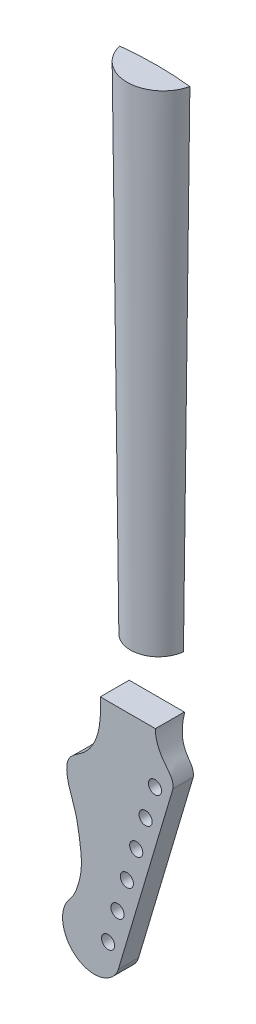
ISO-10303-21;
HEADER;
FILE_DESCRIPTION(('STEP AP214'),'2;1');
FILE_NAME('part.step','',(''),(''),'','','');
FILE_SCHEMA(('AUTOMOTIVE_DESIGN { 1 0 10303 214 1 1 1 1 }'));
ENDSEC;
DATA;
#1=APPLICATION_CONTEXT('core data for automotive mechanical design processes');
#2=APPLICATION_PROTOCOL_DEFINITION('international standard','automotive_design',2000,#1);
#3=PRODUCT_CONTEXT('',#1,'mechanical');
#4=PRODUCT('Part','Part','',(#3));
#5=PRODUCT_RELATED_PRODUCT_CATEGORY('part','',(#4));
#6=PRODUCT_DEFINITION_FORMATION('','',#4);
#7=PRODUCT_DEFINITION_CONTEXT('part definition',#1,'design');
#8=PRODUCT_DEFINITION('design','',#6,#7);
#9=PRODUCT_DEFINITION_SHAPE('','',#8);
#10=(LENGTH_UNIT() NAMED_UNIT(*) SI_UNIT(.MILLI.,.METRE.));
#11=(NAMED_UNIT(*) PLANE_ANGLE_UNIT() SI_UNIT($,.RADIAN.));
#12=(NAMED_UNIT(*) SI_UNIT($,.STERADIAN.) SOLID_ANGLE_UNIT());
#13=UNCERTAINTY_MEASURE_WITH_UNIT(LENGTH_MEASURE(1.E-05),#10,'distance_accuracy_value','');
#14=(GEOMETRIC_REPRESENTATION_CONTEXT(3) GLOBAL_UNCERTAINTY_ASSIGNED_CONTEXT((#13)) GLOBAL_UNIT_ASSIGNED_CONTEXT((#10,
#11,#12)) REPRESENTATION_CONTEXT('',''));
#15=CARTESIAN_POINT('',(0.,0.,0.));
#16=DIRECTION('',(0.,0.,1.));
#17=DIRECTION('',(1.,0.,0.));
#18=AXIS2_PLACEMENT_3D('',#15,#16,#17);
#19=CARTESIAN_POINT('',(56.6375080453473,-20.3369897013631,0.));
#20=DIRECTION('',(0.,0.,-1.));
#21=DIRECTION('',(-1.,0.,0.));
#22=AXIS2_PLACEMENT_3D('',#19,#20,#21);
#23=PLANE('',#22);
#24=CARTESIAN_POINT('',(64.4678967595988,-36.3869171248618,0.));
#25=CARTESIAN_POINT('',(65.2962653016021,-30.5662360862277,0.));
#26=CARTESIAN_POINT('',(56.4837621605687,-22.0007319523904,0.));
#27=CARTESIAN_POINT('',(50.9375501111084,-10.7673234647444,0.));
#28=CARTESIAN_POINT('',(51.151028,-3.25,0.));
#29=B_SPLINE_CURVE_WITH_KNOTS('',3,(#24,#25,#26,#27,#28),.UNSPECIFIED.,.F.,.F.,(4,1,4),(0.,
0.401837933237775,1.),.UNSPECIFIED.);
#30=CARTESIAN_POINT('',(51.1549542125218,-4.75,0.));
#31=VERTEX_POINT('',#30);
#32=CARTESIAN_POINT('',(51.151028,-3.25,0.));
#33=VERTEX_POINT('',#32);
#34=EDGE_CURVE('E239',#31,#33,#29,.T.);
#35=ORIENTED_EDGE('',*,*,#34,.F.);
#36=DIRECTION('',(-1.,0.,0.));
#37=VECTOR('',#36,1.);
#38=CARTESIAN_POINT('',(89.,-4.75,0.));
#39=LINE('',#38,#37);
#40=CARTESIAN_POINT('',(9.14908,-4.75,0.));
#41=VERTEX_POINT('',#40);
#42=EDGE_CURVE('E173',#31,#41,#39,.T.);
#43=ORIENTED_EDGE('',*,*,#42,.T.);
#44=DIRECTION('',(0.,-1.,0.));
#45=VECTOR('',#44,1.);
#46=CARTESIAN_POINT('',(9.14908,-3.25,0.));
#47=LINE('',#46,#45);
#48=CARTESIAN_POINT('',(9.14908,-3.25,0.));
#49=VERTEX_POINT('',#48);
#50=EDGE_CURVE('E155',#49,#41,#47,.T.);
#51=ORIENTED_EDGE('',*,*,#50,.F.);
#52=DIRECTION('',(-1.,0.,0.));
#53=VECTOR('',#52,1.);
#54=CARTESIAN_POINT('',(51.151028,-3.25,0.));
#55=LINE('',#54,#53);
#56=EDGE_CURVE('E319',#33,#49,#55,.T.);
#57=ORIENTED_EDGE('',*,*,#56,.F.);
#58=EDGE_LOOP('',(#35,#43,#51,#57));
#59=FACE_BOUND('',#58,.T.);
#60=ADVANCED_FACE('F49',(#59),#23,.T.);
#61=CARTESIAN_POINT('',(64.4678967595988,-36.3869171248618,22.));
#62=CARTESIAN_POINT('',(65.2962653016021,-30.5662360862277,22.));
#63=CARTESIAN_POINT('',(56.4837621605687,-22.0007319523904,22.));
#64=CARTESIAN_POINT('',(50.9375501111084,-10.7673234647444,22.));
#65=CARTESIAN_POINT('',(51.151028,-3.25,22.));
#66=B_SPLINE_CURVE_WITH_KNOTS('',3,(#61,#62,#63,#64,#65),.UNSPECIFIED.,.F.,.F.,(4,1,4),(0.,
0.401837933237775,1.),.UNSPECIFIED.);
#67=DIRECTION('',(0.,0.,-1.));
#68=VECTOR('',#67,1.);
#69=SURFACE_OF_LINEAR_EXTRUSION('',#66,#68);
#70=CARTESIAN_POINT('',(51.1549542125218,-4.75000002359859,4.21852207528305E-09));
#71=CARTESIAN_POINT('',(51.1680654468338,-5.14091643297609,0.150058757586606));
#72=CARTESIAN_POINT('',(51.1906814220311,-5.53154264494164,0.300006112774302));
#73=CARTESIAN_POINT('',(51.2545517430317,-6.31103438426002,0.599224958035812));
#74=CARTESIAN_POINT('',(51.2957855595916,-6.69990137569232,0.748497010118848));
#75=CARTESIAN_POINT('',(51.3965222496747,-7.4753379481485,1.04615922148701));
#76=CARTESIAN_POINT('',(51.4560147588833,-7.86190870602771,1.19454983252432));
#77=CARTESIAN_POINT('',(51.5927661422065,-8.63223932063184,1.4902520506242));
#78=CARTESIAN_POINT('',(51.6700224611351,-9.01599957344202,1.63756380972966));
#79=CARTESIAN_POINT('',(51.840038295133,-9.77272447515635,1.92804328389599));
#80=CARTESIAN_POINT('',(51.9324673798035,-10.1457539953343,2.07123590070518));
#81=CARTESIAN_POINT('',(52.1332053641683,-10.8881343898938,2.3562090344966));
#82=CARTESIAN_POINT('',(52.2415170784595,-11.2574845998414,2.49798929642658));
#83=CARTESIAN_POINT('',(52.4733131476984,-11.9920514774737,2.77996310207662));
#84=CARTESIAN_POINT('',(52.5967992872388,-12.3572676534475,2.92015645704661));
#85=CARTESIAN_POINT('',(52.8581714686001,-13.0831318388325,3.1987896121365));
#86=CARTESIAN_POINT('',(52.9960560072269,-13.443780320712,3.33722959362004));
#87=CARTESIAN_POINT('',(53.2798751215128,-14.1464328261318,3.60695261957817));
#88=CARTESIAN_POINT('',(53.4252932601499,-14.4886190444293,3.73830560206738));
#89=CARTESIAN_POINT('',(53.7280288740928,-15.1683273649276,3.99922118062102));
#90=CARTESIAN_POINT('',(53.8853451725619,-15.5058499245114,4.12878395225833));
#91=CARTESIAN_POINT('',(54.2112200264707,-16.176167239746,4.38609466163837));
#92=CARTESIAN_POINT('',(54.3797797481468,-16.5089615005924,4.51384240944352));
#93=CARTESIAN_POINT('',(54.7274837219142,-17.1697600424618,4.76749920407103));
#94=CARTESIAN_POINT('',(54.9066297805539,-17.4977634939578,4.89340793246781));
#95=CARTESIAN_POINT('',(55.2784161795221,-18.1552291549036,5.1457853539757));
#96=CARTESIAN_POINT('',(55.4712514860682,-18.4845951773182,5.27221712434334));
#97=CARTESIAN_POINT('',(55.8665364925132,-19.1382184097607,5.52311957574163));
#98=CARTESIAN_POINT('',(56.0689853946862,-19.4624760407143,5.64759041835047));
#99=CARTESIAN_POINT('',(56.4827947449292,-20.1058151737395,5.89454517384971));
#100=CARTESIAN_POINT('',(56.6941516381016,-20.4248986715523,6.01702985283335));
#101=CARTESIAN_POINT('',(57.1250817005319,-21.057828828609,6.25998897681674));
#102=CARTESIAN_POINT('',(57.3446480064048,-21.371679558657,6.38046498445179));
#103=CARTESIAN_POINT('',(57.5681076748866,-21.6830789205097,6.5));
#104=B_SPLINE_CURVE_WITH_KNOTS('',3,(#70,#71,#72,#73,#74,#75,#76,#77,#78,#79,#80,#81,#82,#83,
#84,#85,#86,#87,#88,#89,#90,#91,#92,#93,#94,#95,#96,#97,#98,#99,#100,#101,#102,#103),
.UNSPECIFIED.,.F.,.F.,(4,2,2,2,2,2,2,2,2,2,2,2,2,2,2,2,4),(0.,1.25667336214889,2.51196440576778,
3.76654421316922,5.02094367178069,6.25096763315607,7.48120983387477,8.71159685628633,
9.94185555435961,11.1246089514657,12.3072455160601,13.4900049422633,14.6729667913902,
15.8789869484353,17.0849072054945,18.2903506920355,19.4948079783741),.UNSPECIFIED.);
#105=CARTESIAN_POINT('',(53.9451946415747,-15.627067259028,4.17531492740211));
#106=VERTEX_POINT('',#105);
#107=EDGE_CURVE('E291',#31,#106,#104,.T.);
#108=ORIENTED_EDGE('',*,*,#107,.F.);
#109=ORIENTED_EDGE('',*,*,#34,.T.);
#110=DIRECTION('',(0.,0.,-1.));
#111=VECTOR('',#110,1.);
#112=CARTESIAN_POINT('',(51.151028,-3.25,22.));
#113=LINE('',#112,#111);
#114=CARTESIAN_POINT('',(51.151028,-3.25,22.));
#115=VERTEX_POINT('',#114);
#116=EDGE_CURVE('E162',#115,#33,#113,.T.);
#117=ORIENTED_EDGE('',*,*,#116,.F.);
#118=CARTESIAN_POINT('',(64.4678967595988,-36.3869171248618,22.));
#119=VERTEX_POINT('',#118);
#120=EDGE_CURVE('E215',#119,#115,#66,.T.);
#121=ORIENTED_EDGE('',*,*,#120,.F.);
#122=DIRECTION('',(0.,0.,-1.));
#123=VECTOR('',#122,1.);
#124=CARTESIAN_POINT('',(64.4678967595988,-36.3869171248618,22.));
#125=LINE('',#124,#123);
#126=CARTESIAN_POINT('',(64.4678967595988,-36.3869171248618,6.5));
#127=VERTEX_POINT('',#126);
#128=EDGE_CURVE('E165',#119,#127,#125,.T.);
#129=ORIENTED_EDGE('',*,*,#128,.T.);
#130=CARTESIAN_POINT('',(64.4678967595988,-36.3869171248618,6.5));
#131=CARTESIAN_POINT('',(65.2962653016021,-30.5662360862277,6.5));
#132=CARTESIAN_POINT('',(56.4837621605687,-22.0007319523904,6.5));
#133=CARTESIAN_POINT('',(50.9375501111084,-10.7673234647444,6.5));
#134=CARTESIAN_POINT('',(51.151028,-3.25,6.5));
#135=B_SPLINE_CURVE_WITH_KNOTS('',3,(#130,#131,#132,#133,#134),.UNSPECIFIED.,.F.,.F.,(4,1,4),
(0.,0.401837933237775,1.),.UNSPECIFIED.);
#136=CARTESIAN_POINT('',(62.4927121618197,-28.1699454925965,6.5));
#137=VERTEX_POINT('',#136);
#138=EDGE_CURVE('E136',#127,#137,#135,.T.);
#139=ORIENTED_EDGE('',*,*,#138,.T.);
#140=CARTESIAN_POINT('',(62.4927121610172,-28.1699454931134,6.5));
#141=CARTESIAN_POINT('',(62.375614539713,-27.9876341963071,6.49999392580149));
#142=CARTESIAN_POINT('',(62.255558318861,-27.8072669409178,6.49857546535381));
#143=CARTESIAN_POINT('',(62.0105828859032,-27.4499856605042,6.49305184864964));
#144=CARTESIAN_POINT('',(61.8856652381194,-27.2730705517058,6.48894755003454));
#145=CARTESIAN_POINT('',(61.6326274882078,-26.9230867739052,6.47821908608642));
#146=CARTESIAN_POINT('',(61.5045282261052,-26.7500025338295,6.47160859370002));
#147=CARTESIAN_POINT('',(61.2453877230433,-26.4061464062348,6.45595240036816));
#148=CARTESIAN_POINT('',(61.1143462289659,-26.2353747197049,6.44690648916389));
#149=CARTESIAN_POINT('',(60.7190525693369,-25.7268924262354,6.41628289898456));
#150=CARTESIAN_POINT('',(60.4517252212223,-25.3917867321417,6.39118044494661));
#151=CARTESIAN_POINT('',(60.0497152374659,-24.8914431801342,6.34650939088679));
#152=CARTESIAN_POINT('',(59.9157422718939,-24.7252934491955,6.33047853352343));
#153=CARTESIAN_POINT('',(59.6480543836191,-24.3930280143909,6.29601738312702));
#154=CARTESIAN_POINT('',(59.5143394631078,-24.2269123108245,6.27758706980656));
#155=CARTESIAN_POINT('',(59.2482854757439,-23.8946406176895,6.23830262335778));
#156=CARTESIAN_POINT('',(59.1159435900558,-23.7284860663392,6.21745548125596));
#157=CARTESIAN_POINT('',(58.918724686557,-23.4784915554692,6.18425177806883));
#158=CARTESIAN_POINT('',(58.8532008986447,-23.3950331865278,6.17286174864829));
#159=CARTESIAN_POINT('',(58.7226849015026,-23.2277945228981,6.14941952711127));
#160=CARTESIAN_POINT('',(58.6576926923494,-23.1440142281634,6.13736733489942));
#161=CARTESIAN_POINT('',(58.4638244243858,-22.8925236884775,6.10025289660904));
#162=CARTESIAN_POINT('',(58.335781907922,-22.7243161156035,6.07418668345491));
#163=CARTESIAN_POINT('',(58.0820206129897,-22.3866035608632,6.01930218003816));
#164=CARTESIAN_POINT('',(57.9563018640345,-22.2170985625572,5.99048385485059));
#165=CARTESIAN_POINT('',(57.5818311077652,-21.7053461997294,5.89955430165509));
#166=CARTESIAN_POINT('',(57.3367558274747,-21.3611453902544,5.83315671393475));
#167=CARTESIAN_POINT('',(56.8573766901676,-20.6679315543294,5.68837713837883));
#168=CARTESIAN_POINT('',(56.6230700943603,-20.318919781131,5.60999821992936));
#169=CARTESIAN_POINT('',(56.1658046654258,-19.6159195207824,5.44052917996557));
#170=CARTESIAN_POINT('',(55.9428601443982,-19.2619254403392,5.34942354238842));
#171=CARTESIAN_POINT('',(55.5089305766262,-18.5488187663214,5.15369283654371));
#172=CARTESIAN_POINT('',(55.2979832577829,-18.1896940385724,5.04902818317029));
#173=CARTESIAN_POINT('',(54.8886907547745,-17.4661761882196,4.82526649273988));
#174=CARTESIAN_POINT('',(54.6904145912704,-17.1017656187782,4.7060992411768));
#175=CARTESIAN_POINT('',(54.3071146221356,-16.3675770329247,4.45233203398029));
#176=CARTESIAN_POINT('',(54.1222004790933,-15.9977792544597,4.31762377971412));
#177=CARTESIAN_POINT('',(53.9451946415747,-15.6270672590279,4.17531492740206));
#178=B_SPLINE_CURVE_WITH_KNOTS('',3,(#140,#141,#142,#143,#144,#145,#146,#147,#148,#149,#150,
#151,#152,#153,#154,#155,#156,#157,#158,#159,#160,#161,#162,#163,#164,#165,#166,#167,#168,#169,
#170,#171,#172,#173,#174,#175,#176,#177),.UNSPECIFIED.,.F.,.F.,(4,2,2,2,2,2,2,2,2,2,2,2,2,2,2,2,
2,2,4),(0.,0.649946905278127,1.29968637082793,1.94593093055724,2.59223130089823,
3.88025543201119,4.52235862228419,5.16446724189611,5.80476275554744,6.12490861336931,
6.44505451730247,7.08400981305202,7.72297321837733,9.00579587777505,10.288290451773,
11.5723624800126,12.8602715580577,14.1546845941654,15.4587352324983),.UNSPECIFIED.);
#179=EDGE_CURVE('E188',#137,#106,#178,.T.);
#180=ORIENTED_EDGE('',*,*,#179,.T.);
#181=EDGE_LOOP('',(#108,#109,#117,#121,#129,#139,#180));
#182=FACE_BOUND('',#181,.T.);
#183=ADVANCED_FACE('F204',(#182),#69,.F.);
#184=CARTESIAN_POINT('',(9.14908,-3.25,22.));
#185=DIRECTION('',(1.,0.,0.));
#186=DIRECTION('',(0.,0.,-1.));
#187=AXIS2_PLACEMENT_3D('',#184,#185,#186);
#188=PLANE('',#187);
#189=DIRECTION('',(0.,0.933580426497202,-0.358367949545301));
#190=VECTOR('',#189,1.);
#191=CARTESIAN_POINT('',(9.14908,-10.8030780508394,2.32355896497953));
#192=LINE('',#191,#190);
#193=CARTESIAN_POINT('',(9.14908,-15.6270672590279,4.17531492740205));
#194=VERTEX_POINT('',#193);
#195=EDGE_CURVE('E300',#194,#41,#192,.T.);
#196=ORIENTED_EDGE('',*,*,#195,.F.);
#197=CARTESIAN_POINT('',(9.14908,-28.1699454931134,-28.5));
#198=DIRECTION('',(1.,0.,0.));
#199=DIRECTION('',(0.,0.,-1.));
#200=AXIS2_PLACEMENT_3D('',#197,#198,#199);
#201=CIRCLE('',#200,35.);
#202=CARTESIAN_POINT('',(9.14908,-15.8461860828899,4.25858595847703));
#203=VERTEX_POINT('',#202);
#204=EDGE_CURVE('E178',#194,#203,#201,.T.);
#205=ORIENTED_EDGE('',*,*,#204,.T.);
#206=DIRECTION('',(0.,0.,-1.));
#207=VECTOR('',#206,1.);
#208=CARTESIAN_POINT('',(9.14908,-15.8461860828899,22.));
#209=LINE('',#208,#207);
#210=CARTESIAN_POINT('',(9.14908,-15.8461860828899,22.));
#211=VERTEX_POINT('',#210);
#212=EDGE_CURVE('E150',#211,#203,#209,.T.);
#213=ORIENTED_EDGE('',*,*,#212,.F.);
#214=DIRECTION('',(0.,-1.,0.));
#215=VECTOR('',#214,1.);
#216=CARTESIAN_POINT('',(9.14908,-3.25,22.));
#217=LINE('',#216,#215);
#218=CARTESIAN_POINT('',(9.14908,-3.25,22.));
#219=VERTEX_POINT('',#218);
#220=EDGE_CURVE('E228',#219,#211,#217,.T.);
#221=ORIENTED_EDGE('',*,*,#220,.F.);
#222=DIRECTION('',(0.,0.,-1.));
#223=VECTOR('',#222,1.);
#224=CARTESIAN_POINT('',(9.14908,-3.25,22.));
#225=LINE('',#224,#223);
#226=EDGE_CURVE('E159',#219,#49,#225,.T.);
#227=ORIENTED_EDGE('',*,*,#226,.T.);
#228=ORIENTED_EDGE('',*,*,#50,.T.);
#229=EDGE_LOOP('',(#196,#205,#213,#221,#227,#228));
#230=FACE_BOUND('',#229,.T.);
#231=ADVANCED_FACE('F210',(#230),#188,.F.);
#232=CARTESIAN_POINT('',(9.14908,-15.8461860828899,22.));
#233=CARTESIAN_POINT('',(8.81382651827049,-24.4004539347963,22.));
#234=CARTESIAN_POINT('',(5.67013763522838,-42.7138837849039,22.));
#235=CARTESIAN_POINT('',(-21.2448293909966,-56.6571829057546,22.));
#236=CARTESIAN_POINT('',(-10.2412380444105,-86.897150300012,22.));
#237=CARTESIAN_POINT('',(-8.60458134429202,-92.5709925155884,22.));
#238=CARTESIAN_POINT('',(-3.49098725072572,-123.919790761188,22.));
#239=CARTESIAN_POINT('',(-6.82955309354449,-132.121428200447,22.));
#240=CARTESIAN_POINT('',(-8.26535198019939,-137.230943622345,22.));
#241=B_SPLINE_CURVE_WITH_KNOTS('',3,(#232,#233,#234,#235,#236,#237,#238,#239,#240),
.UNSPECIFIED.,.F.,.F.,(4,1,1,1,1,1,4),(0.,0.241122101621908,0.315889976992155,0.476811466885725,
0.625347755042572,0.735303781085615,0.929974714109899),.UNSPECIFIED.);
#242=DIRECTION('',(0.,0.,-1.));
#243=VECTOR('',#242,1.);
#244=SURFACE_OF_LINEAR_EXTRUSION('',#241,#243);
#245=ORIENTED_EDGE('',*,*,#212,.T.);
#246=CARTESIAN_POINT('',(9.14908,-15.8461860828899,4.25858595847703));
#247=CARTESIAN_POINT('',(9.12820092381489,-16.3786153509334,4.45891575617462));
#248=CARTESIAN_POINT('',(9.09999140201935,-16.9157099379083,4.64612322067499));
#249=CARTESIAN_POINT('',(9.02815498609966,-17.9978213809082,4.99403817475947));
#250=CARTESIAN_POINT('',(8.98451709517224,-18.5428436211046,5.15472664238745));
#251=CARTESIAN_POINT('',(8.88107963244223,-19.6388011526872,5.44910530963724));
#252=CARTESIAN_POINT('',(8.82127520318686,-20.1897381733939,5.58278737369533));
#253=CARTESIAN_POINT('',(8.68595382601431,-21.2856646198614,5.82077315120157));
#254=CARTESIAN_POINT('',(8.61073353617688,-21.8305868591093,5.92555471804972));
#255=CARTESIAN_POINT('',(8.44329939553976,-22.9220303375753,6.10874897327267));
#256=CARTESIAN_POINT('',(8.35109188773014,-23.4685509052662,6.18717147329563));
#257=CARTESIAN_POINT('',(8.14905704505887,-24.5611677729218,6.31779983387749));
#258=CARTESIAN_POINT('',(8.03924041245751,-25.1072641294144,6.37002153934236));
#259=CARTESIAN_POINT('',(7.87443542611811,-25.862511789252,6.42449343832316));
#260=CARTESIAN_POINT('',(7.8271930619249,-26.0726290112243,6.43773697507111));
#261=CARTESIAN_POINT('',(7.72996963640349,-26.4924089861673,6.46040666921571));
#262=CARTESIAN_POINT('',(7.67998898048613,-26.7020718016615,6.46983338997678));
#263=CARTESIAN_POINT('',(7.5770175589996,-27.1218206588705,6.48493594251848));
#264=CARTESIAN_POINT('',(7.52401393803607,-27.3319041715484,6.49059422064428));
#265=CARTESIAN_POINT('',(7.41517391629182,-27.7514369478491,6.49812688809417));
#266=CARTESIAN_POINT('',(7.35933710256666,-27.9608861142729,6.50000072419362));
#267=CARTESIAN_POINT('',(7.30207414091533,-28.1699454930675,6.5));
#268=B_SPLINE_CURVE_WITH_KNOTS('',3,(#246,#247,#248,#249,#250,#251,#252,#253,#254,#255,#256,
#257,#258,#259,#260,#261,#262,#263,#264,#265,#266,#267),.UNSPECIFIED.,.F.,.F.,(4,2,2,2,2,2,2,2,
2,2,4),(0.,1.70756406898736,3.4163476919048,5.12564531349996,6.80470654741389,8.48314208960706,
10.1605613723087,10.8078330967516,11.4550092486287,12.1051792899519,12.7554443688146),.UNSPECIFIED.);
#269=CARTESIAN_POINT('',(7.30207414091832,-28.1699454930566,6.5));
#270=VERTEX_POINT('',#269);
#271=EDGE_CURVE('E181',#203,#270,#268,.T.);
#272=ORIENTED_EDGE('',*,*,#271,.T.);
#273=CARTESIAN_POINT('',(9.14908,-15.8461860828899,6.5));
#274=CARTESIAN_POINT('',(8.81382651827049,-24.4004539347963,6.5));
#275=CARTESIAN_POINT('',(5.67013763522838,-42.7138837849039,6.5));
#276=CARTESIAN_POINT('',(-21.2448293909966,-56.6571829057546,6.5));
#277=CARTESIAN_POINT('',(-10.2412380444105,-86.897150300012,6.5));
#278=CARTESIAN_POINT('',(-8.60458134429202,-92.5709925155884,6.5));
#279=CARTESIAN_POINT('',(-3.49098725072572,-123.919790761188,6.5));
#280=CARTESIAN_POINT('',(-6.82955309354449,-132.121428200447,6.5));
#281=CARTESIAN_POINT('',(-8.26535198019939,-137.230943622345,6.5));
#282=B_SPLINE_CURVE_WITH_KNOTS('',3,(#273,#274,#275,#276,#277,#278,#279,#280,#281),
.UNSPECIFIED.,.F.,.F.,(4,1,1,1,1,1,4),(0.,0.241122101621908,0.315889976992155,0.476811466885725,
0.625347755042572,0.735303781085615,0.929974714109899),.UNSPECIFIED.);
#283=CARTESIAN_POINT('',(-8.26535198020513,-137.230943622344,6.5));
#284=VERTEX_POINT('',#283);
#285=EDGE_CURVE('E145',#270,#284,#282,.T.);
#286=ORIENTED_EDGE('',*,*,#285,.T.);
#287=DIRECTION('',(0.,0.,-1.));
#288=VECTOR('',#287,1.);
#289=CARTESIAN_POINT('',(-8.26535198020513,-137.230943622344,22.));
#290=LINE('',#289,#288);
#291=CARTESIAN_POINT('',(-8.26535198020513,-137.230943622344,22.));
#292=VERTEX_POINT('',#291);
#293=EDGE_CURVE('E144',#292,#284,#290,.T.);
#294=ORIENTED_EDGE('',*,*,#293,.F.);
#295=EDGE_CURVE('E229',#211,#292,#241,.T.);
#296=ORIENTED_EDGE('',*,*,#295,.F.);
#297=EDGE_LOOP('',(#245,#272,#286,#294,#296));
#298=FACE_BOUND('',#297,.T.);
#299=ADVANCED_FACE('F195',(#298),#244,.F.);
#300=CARTESIAN_POINT('',(56.6375080453473,-20.3369897013631,22.));
#301=DIRECTION('',(0.,0.,-1.));
#302=DIRECTION('',(-1.,0.,0.));
#303=AXIS2_PLACEMENT_3D('',#300,#301,#302);
#304=PLANE('',#303);
#305=CARTESIAN_POINT('',(2.82778361815029,-165.10940239539,22.));
#306=DIRECTION('',(0.,0.,1.));
#307=DIRECTION('',(0.492719665115745,-0.870188101279389,0.));
#308=AXIS2_PLACEMENT_3D('',#305,#306,#307);
#309=ELLIPSE('',#308,24.0145747821876,21.8622032851158);
#310=CARTESIAN_POINT('',(-14.3635160242581,-148.63244704708,22.));
#311=VERTEX_POINT('',#310);
#312=CARTESIAN_POINT('',(19.4412668680975,-182.232634909366,22.));
#313=VERTEX_POINT('',#312);
#314=EDGE_CURVE('E148',#311,#313,#309,.T.);
#315=ORIENTED_EDGE('',*,*,#314,.T.);
#316=CARTESIAN_POINT('',(8.47371639429525,-171.999705875869,22.));
#317=DIRECTION('',(0.,0.,-1.));
#318=DIRECTION('',(-1.,0.,0.));
#319=AXIS2_PLACEMENT_3D('',#316,#317,#318);
#320=CIRCLE('',#319,15.);
#321=CARTESIAN_POINT('',(22.8509752570106,-176.276904444379,22.));
#322=VERTEX_POINT('',#321);
#323=EDGE_CURVE('E12',#313,#322,#320,.F.);
#324=ORIENTED_EDGE('',*,*,#323,.T.);
#325=DIRECTION('',(0.285146571234047,0.95848392418103,0.));
#326=VECTOR('',#325,1.);
#327=CARTESIAN_POINT('',(61.8224691280819,-45.2791855691915,22.));
#328=LINE('',#327,#326);
#329=EDGE_CURVE('E222',#322,#119,#328,.T.);
#330=ORIENTED_EDGE('',*,*,#329,.T.);
#331=ORIENTED_EDGE('',*,*,#120,.T.);
#332=DIRECTION('',(-1.,0.,0.));
#333=VECTOR('',#332,1.);
#334=CARTESIAN_POINT('',(51.151028,-3.25,22.));
#335=LINE('',#334,#333);
#336=EDGE_CURVE('E221',#115,#219,#335,.T.);
#337=ORIENTED_EDGE('',*,*,#336,.T.);
#338=ORIENTED_EDGE('',*,*,#220,.T.);
#339=ORIENTED_EDGE('',*,*,#295,.T.);
#340=CARTESIAN_POINT('',(-37.1467243941997,-129.115136362156,22.));
#341=DIRECTION('',(0.,0.,-1.));
#342=DIRECTION('',(1.,0.,0.));
#343=AXIS2_PLACEMENT_3D('',#340,#341,#342);
#344=CIRCLE('',#343,30.0000000000059);
#345=EDGE_CURVE('E152',#292,#311,#344,.T.);
#346=ORIENTED_EDGE('',*,*,#345,.T.);
#347=EDGE_LOOP('',(#315,#324,#330,#331,#337,#338,#339,#346));
#348=FACE_BOUND('',#347,.T.);
#349=CARTESIAN_POINT('',(50.799904,-42.,22.));
#350=DIRECTION('',(0.,0.,1.));
#351=DIRECTION('',(1.,0.,0.));
#352=AXIS2_PLACEMENT_3D('',#349,#350,#351);
#353=CIRCLE('',#352,5.);
#354=CARTESIAN_POINT('',(55.799904,-42.,22.));
#355=VERTEX_POINT('',#354);
#356=EDGE_CURVE('E315',#355,#355,#353,.T.);
#357=ORIENTED_EDGE('',*,*,#356,.F.);
#358=EDGE_LOOP('',(#357));
#359=FACE_BOUND('',#358,.T.);
#360=CARTESIAN_POINT('',(43.659964,-66.,22.));
#361=DIRECTION('',(0.,0.,1.));
#362=DIRECTION('',(1.,0.,0.));
#363=AXIS2_PLACEMENT_3D('',#360,#361,#362);
#364=CIRCLE('',#363,5.);
#365=CARTESIAN_POINT('',(48.659964,-66.,22.));
#366=VERTEX_POINT('',#365);
#367=EDGE_CURVE('E313',#366,#366,#364,.T.);
#368=ORIENTED_EDGE('',*,*,#367,.F.);
#369=EDGE_LOOP('',(#368));
#370=FACE_BOUND('',#369,.T.);
#371=CARTESIAN_POINT('',(36.520024,-90.,22.));
#372=DIRECTION('',(0.,0.,1.));
#373=DIRECTION('',(1.,0.,0.));
#374=AXIS2_PLACEMENT_3D('',#371,#372,#373);
#375=CIRCLE('',#374,5.);
#376=CARTESIAN_POINT('',(41.520024,-90.,22.));
#377=VERTEX_POINT('',#376);
#378=EDGE_CURVE('E310',#377,#377,#375,.T.);
#379=ORIENTED_EDGE('',*,*,#378,.F.);
#380=EDGE_LOOP('',(#379));
#381=FACE_BOUND('',#380,.T.);
#382=CARTESIAN_POINT('',(29.380084,-114.,22.));
#383=DIRECTION('',(0.,0.,1.));
#384=DIRECTION('',(1.,0.,0.));
#385=AXIS2_PLACEMENT_3D('',#382,#383,#384);
#386=CIRCLE('',#385,5.);
#387=CARTESIAN_POINT('',(34.380084,-114.,22.));
#388=VERTEX_POINT('',#387);
#389=EDGE_CURVE('E307',#388,#388,#386,.T.);
#390=ORIENTED_EDGE('',*,*,#389,.F.);
#391=EDGE_LOOP('',(#390));
#392=FACE_BOUND('',#391,.T.);
#393=CARTESIAN_POINT('',(22.240144,-138.,22.));
#394=DIRECTION('',(0.,0.,1.));
#395=DIRECTION('',(1.,0.,0.));
#396=AXIS2_PLACEMENT_3D('',#393,#394,#395);
#397=CIRCLE('',#396,5.);
#398=CARTESIAN_POINT('',(27.240144,-138.,22.));
#399=VERTEX_POINT('',#398);
#400=EDGE_CURVE('E304',#399,#399,#397,.T.);
#401=ORIENTED_EDGE('',*,*,#400,.F.);
#402=EDGE_LOOP('',(#401));
#403=FACE_BOUND('',#402,.T.);
#404=CARTESIAN_POINT('',(15.100204,-162.,22.));
#405=DIRECTION('',(0.,0.,1.));
#406=DIRECTION('',(1.,0.,0.));
#407=AXIS2_PLACEMENT_3D('',#404,#405,#406);
#408=CIRCLE('',#407,5.);
#409=CARTESIAN_POINT('',(20.100204,-162.,22.));
#410=VERTEX_POINT('',#409);
#411=EDGE_CURVE('E299',#410,#410,#408,.T.);
#412=ORIENTED_EDGE('',*,*,#411,.F.);
#413=EDGE_LOOP('',(#412));
#414=FACE_BOUND('',#413,.T.);
#415=ADVANCED_FACE('F251',(#348,#359,#370,#381,#392,#403,#414),#304,.F.);
#416=CARTESIAN_POINT('',(51.151028,-3.25,22.));
#417=DIRECTION('',(0.,-1.,0.));
#418=DIRECTION('',(1.,0.,0.));
#419=AXIS2_PLACEMENT_3D('',#416,#417,#418);
#420=PLANE('',#419);
#421=ORIENTED_EDGE('',*,*,#56,.T.);
#422=ORIENTED_EDGE('',*,*,#226,.F.);
#423=ORIENTED_EDGE('',*,*,#336,.F.);
#424=ORIENTED_EDGE('',*,*,#116,.T.);
#425=EDGE_LOOP('',(#421,#422,#423,#424));
#426=FACE_BOUND('',#425,.T.);
#427=ADVANCED_FACE('F212',(#426),#420,.F.);
#428=CARTESIAN_POINT('',(-37.1467243941997,-129.115136362156,22.));
#429=DIRECTION('',(0.,0.,-1.));
#430=DIRECTION('',(-1.,0.,0.));
#431=AXIS2_PLACEMENT_3D('',#428,#429,#430);
#432=CYLINDRICAL_SURFACE('',#431,30.0000000000059);
#433=ORIENTED_EDGE('',*,*,#293,.T.);
#434=CARTESIAN_POINT('',(-37.1467243941997,-129.115136362156,6.5));
#435=DIRECTION('',(0.,0.,1.));
#436=DIRECTION('',(0.,-1.,0.));
#437=AXIS2_PLACEMENT_3D('',#434,#435,#436);
#438=CIRCLE('',#437,30.0000000000059);
#439=CARTESIAN_POINT('',(-14.3635160242581,-148.63244704708,6.5));
#440=VERTEX_POINT('',#439);
#441=EDGE_CURVE('E133',#284,#440,#438,.F.);
#442=ORIENTED_EDGE('',*,*,#441,.T.);
#443=DIRECTION('',(0.,0.,-1.));
#444=VECTOR('',#443,1.);
#445=CARTESIAN_POINT('',(-14.3635160242581,-148.63244704708,22.));
#446=LINE('',#445,#444);
#447=EDGE_CURVE('E142',#311,#440,#446,.T.);
#448=ORIENTED_EDGE('',*,*,#447,.F.);
#449=ORIENTED_EDGE('',*,*,#345,.F.);
#450=EDGE_LOOP('',(#433,#442,#448,#449));
#451=FACE_BOUND('',#450,.T.);
#452=ADVANCED_FACE('F140',(#451),#432,.F.);
#453=DIRECTION('',(0.,0.,-1.));
#454=VECTOR('',#453,1.);
#455=SURFACE_OF_LINEAR_EXTRUSION('',#309,#454);
#456=CARTESIAN_POINT('',(2.82778361815029,-165.10940239539,6.5));
#457=DIRECTION('',(0.,0.,1.));
#458=DIRECTION('',(0.492719665115745,-0.870188101279389,0.));
#459=AXIS2_PLACEMENT_3D('',#456,#457,#458);
#460=ELLIPSE('',#459,24.0145747821876,21.8622032851158);
#461=CARTESIAN_POINT('',(19.4412668680975,-182.232634909366,6.5));
#462=VERTEX_POINT('',#461);
#463=EDGE_CURVE('E129',#440,#462,#460,.T.);
#464=ORIENTED_EDGE('',*,*,#463,.T.);
#465=DIRECTION('',(0.,0.,-1.));
#466=VECTOR('',#465,1.);
#467=CARTESIAN_POINT('',(19.4412668680975,-182.232634909366,6.5));
#468=LINE('',#467,#466);
#469=EDGE_CURVE('E57',#462,#313,#468,.F.);
#470=ORIENTED_EDGE('',*,*,#469,.T.);
#471=ORIENTED_EDGE('',*,*,#314,.F.);
#472=ORIENTED_EDGE('',*,*,#447,.T.);
#473=EDGE_LOOP('',(#464,#470,#471,#472));
#474=FACE_BOUND('',#473,.T.);
#475=ADVANCED_FACE('F147',(#474),#455,.F.);
#476=CARTESIAN_POINT('',(61.8224691280819,-45.2791855691915,22.));
#477=DIRECTION('',(-0.95848392418103,0.285146571234046,0.));
#478=DIRECTION('',(-0.285146571234046,-0.95848392418103,0.));
#479=AXIS2_PLACEMENT_3D('',#476,#477,#478);
#480=PLANE('',#479);
#481=ORIENTED_EDGE('',*,*,#329,.F.);
#482=DIRECTION('',(0.,0.,-1.));
#483=VECTOR('',#482,1.);
#484=CARTESIAN_POINT('',(22.8509752570107,-176.276904444379,22.));
#485=LINE('',#484,#483);
#486=CARTESIAN_POINT('',(22.8509752570107,-176.276904444379,6.5));
#487=VERTEX_POINT('',#486);
#488=EDGE_CURVE('E340',#322,#487,#485,.T.);
#489=ORIENTED_EDGE('',*,*,#488,.T.);
#490=DIRECTION('',(0.285146571234046,0.95848392418103,0.));
#491=VECTOR('',#490,1.);
#492=CARTESIAN_POINT('',(61.8224691280819,-45.2791855691915,6.5));
#493=LINE('',#492,#491);
#494=EDGE_CURVE('E338',#487,#127,#493,.T.);
#495=ORIENTED_EDGE('',*,*,#494,.T.);
#496=ORIENTED_EDGE('',*,*,#128,.F.);
#497=EDGE_LOOP('',(#481,#489,#495,#496));
#498=FACE_BOUND('',#497,.T.);
#499=ADVANCED_FACE('F245',(#498),#480,.F.);
#500=CARTESIAN_POINT('',(50.799904,-42.,22.));
#501=DIRECTION('',(0.,0.,-1.));
#502=DIRECTION('',(-1.,0.,0.));
#503=AXIS2_PLACEMENT_3D('',#500,#501,#502);
#504=CYLINDRICAL_SURFACE('',#503,5.);
#505=CARTESIAN_POINT('',(50.799904,-42.,6.5));
#506=DIRECTION('',(0.,0.,1.));
#507=DIRECTION('',(0.,-1.,0.));
#508=AXIS2_PLACEMENT_3D('',#505,#506,#507);
#509=CIRCLE('',#508,5.);
#510=CARTESIAN_POINT('',(50.799904,-47.,6.5));
#511=VERTEX_POINT('',#510);
#512=EDGE_CURVE('E341',#511,#511,#509,.T.);
#513=ORIENTED_EDGE('',*,*,#512,.F.);
#514=EDGE_LOOP('',(#513));
#515=FACE_BOUND('',#514,.T.);
#516=ORIENTED_EDGE('',*,*,#356,.T.);
#517=EDGE_LOOP('',(#516));
#518=FACE_BOUND('',#517,.T.);
#519=ADVANCED_FACE('F262',(#515,#518),#504,.F.);
#520=CARTESIAN_POINT('',(43.659964,-66.,22.));
#521=DIRECTION('',(0.,0.,-1.));
#522=DIRECTION('',(-1.,0.,0.));
#523=AXIS2_PLACEMENT_3D('',#520,#521,#522);
#524=CYLINDRICAL_SURFACE('',#523,5.);
#525=CARTESIAN_POINT('',(43.659964,-66.,6.5));
#526=DIRECTION('',(0.,0.,1.));
#527=DIRECTION('',(0.,-1.,0.));
#528=AXIS2_PLACEMENT_3D('',#525,#526,#527);
#529=CIRCLE('',#528,5.);
#530=CARTESIAN_POINT('',(43.659964,-71.,6.5));
#531=VERTEX_POINT('',#530);
#532=EDGE_CURVE('E369',#531,#531,#529,.T.);
#533=ORIENTED_EDGE('',*,*,#532,.F.);
#534=EDGE_LOOP('',(#533));
#535=FACE_BOUND('',#534,.T.);
#536=ORIENTED_EDGE('',*,*,#367,.T.);
#537=EDGE_LOOP('',(#536));
#538=FACE_BOUND('',#537,.T.);
#539=ADVANCED_FACE('F265',(#535,#538),#524,.F.);
#540=CARTESIAN_POINT('',(36.520024,-90.,22.));
#541=DIRECTION('',(0.,0.,-1.));
#542=DIRECTION('',(-1.,0.,0.));
#543=AXIS2_PLACEMENT_3D('',#540,#541,#542);
#544=CYLINDRICAL_SURFACE('',#543,5.);
#545=CARTESIAN_POINT('',(36.520024,-90.,6.5));
#546=DIRECTION('',(0.,0.,1.));
#547=DIRECTION('',(0.,-1.,0.));
#548=AXIS2_PLACEMENT_3D('',#545,#546,#547);
#549=CIRCLE('',#548,5.);
#550=CARTESIAN_POINT('',(36.520024,-95.,6.5));
#551=VERTEX_POINT('',#550);
#552=EDGE_CURVE('E366',#551,#551,#549,.T.);
#553=ORIENTED_EDGE('',*,*,#552,.F.);
#554=EDGE_LOOP('',(#553));
#555=FACE_BOUND('',#554,.T.);
#556=ORIENTED_EDGE('',*,*,#378,.T.);
#557=EDGE_LOOP('',(#556));
#558=FACE_BOUND('',#557,.T.);
#559=ADVANCED_FACE('F269',(#555,#558),#544,.F.);
#560=CARTESIAN_POINT('',(29.380084,-114.,22.));
#561=DIRECTION('',(0.,0.,-1.));
#562=DIRECTION('',(-1.,0.,0.));
#563=AXIS2_PLACEMENT_3D('',#560,#561,#562);
#564=CYLINDRICAL_SURFACE('',#563,5.);
#565=CARTESIAN_POINT('',(29.380084,-114.,6.5));
#566=DIRECTION('',(0.,0.,1.));
#567=DIRECTION('',(0.,-1.,0.));
#568=AXIS2_PLACEMENT_3D('',#565,#566,#567);
#569=CIRCLE('',#568,5.);
#570=CARTESIAN_POINT('',(29.380084,-119.,6.5));
#571=VERTEX_POINT('',#570);
#572=EDGE_CURVE('E363',#571,#571,#569,.T.);
#573=ORIENTED_EDGE('',*,*,#572,.F.);
#574=EDGE_LOOP('',(#573));
#575=FACE_BOUND('',#574,.T.);
#576=ORIENTED_EDGE('',*,*,#389,.T.);
#577=EDGE_LOOP('',(#576));
#578=FACE_BOUND('',#577,.T.);
#579=ADVANCED_FACE('F273',(#575,#578),#564,.F.);
#580=CARTESIAN_POINT('',(22.240144,-138.,22.));
#581=DIRECTION('',(0.,0.,-1.));
#582=DIRECTION('',(-1.,0.,0.));
#583=AXIS2_PLACEMENT_3D('',#580,#581,#582);
#584=CYLINDRICAL_SURFACE('',#583,5.);
#585=CARTESIAN_POINT('',(22.240144,-138.,6.5));
#586=DIRECTION('',(0.,0.,1.));
#587=DIRECTION('',(0.,-1.,0.));
#588=AXIS2_PLACEMENT_3D('',#585,#586,#587);
#589=CIRCLE('',#588,5.);
#590=CARTESIAN_POINT('',(22.240144,-143.,6.5));
#591=VERTEX_POINT('',#590);
#592=EDGE_CURVE('E172',#591,#591,#589,.T.);
#593=ORIENTED_EDGE('',*,*,#592,.F.);
#594=EDGE_LOOP('',(#593));
#595=FACE_BOUND('',#594,.T.);
#596=ORIENTED_EDGE('',*,*,#400,.T.);
#597=EDGE_LOOP('',(#596));
#598=FACE_BOUND('',#597,.T.);
#599=ADVANCED_FACE('F277',(#595,#598),#584,.F.);
#600=CARTESIAN_POINT('',(15.100204,-162.,22.));
#601=DIRECTION('',(0.,0.,-1.));
#602=DIRECTION('',(-1.,0.,0.));
#603=AXIS2_PLACEMENT_3D('',#600,#601,#602);
#604=CYLINDRICAL_SURFACE('',#603,5.);
#605=CARTESIAN_POINT('',(15.100204,-162.,6.5));
#606=DIRECTION('',(0.,0.,1.));
#607=DIRECTION('',(0.,-1.,0.));
#608=AXIS2_PLACEMENT_3D('',#605,#606,#607);
#609=CIRCLE('',#608,5.);
#610=CARTESIAN_POINT('',(15.100204,-167.,6.5));
#611=VERTEX_POINT('',#610);
#612=EDGE_CURVE('E169',#611,#611,#609,.T.);
#613=ORIENTED_EDGE('',*,*,#612,.F.);
#614=EDGE_LOOP('',(#613));
#615=FACE_BOUND('',#614,.T.);
#616=ORIENTED_EDGE('',*,*,#411,.T.);
#617=EDGE_LOOP('',(#616));
#618=FACE_BOUND('',#617,.T.);
#619=ADVANCED_FACE('F281',(#615,#618),#604,.F.);
#620=CARTESIAN_POINT('',(89.,-0.610031039491191,-1.58918519010229));
#621=DIRECTION('',(0.,-0.358367949545301,-0.933580426497202));
#622=DIRECTION('',(0.,0.933580426497202,-0.358367949545301));
#623=AXIS2_PLACEMENT_3D('',#620,#621,#622);
#624=PLANE('',#623);
#625=ORIENTED_EDGE('',*,*,#107,.T.);
#626=DIRECTION('',(-1.,0.,0.));
#627=VECTOR('',#626,1.);
#628=CARTESIAN_POINT('',(89.,-15.6270672590279,4.17531492740206));
#629=LINE('',#628,#627);
#630=EDGE_CURVE('E168',#106,#194,#629,.T.);
#631=ORIENTED_EDGE('',*,*,#630,.T.);
#632=ORIENTED_EDGE('',*,*,#195,.T.);
#633=ORIENTED_EDGE('',*,*,#42,.F.);
#634=EDGE_LOOP('',(#625,#631,#632,#633));
#635=FACE_BOUND('',#634,.T.);
#636=ADVANCED_FACE('F285',(#635),#624,.T.);
#637=CARTESIAN_POINT('',(89.,0.,6.5));
#638=DIRECTION('',(0.,0.,1.));
#639=DIRECTION('',(0.,-1.,0.));
#640=AXIS2_PLACEMENT_3D('',#637,#638,#639);
#641=PLANE('',#640);
#642=ORIENTED_EDGE('',*,*,#512,.T.);
#643=EDGE_LOOP('',(#642));
#644=FACE_BOUND('',#643,.T.);
#645=ORIENTED_EDGE('',*,*,#532,.T.);
#646=EDGE_LOOP('',(#645));
#647=FACE_BOUND('',#646,.T.);
#648=ORIENTED_EDGE('',*,*,#552,.T.);
#649=EDGE_LOOP('',(#648));
#650=FACE_BOUND('',#649,.T.);
#651=ORIENTED_EDGE('',*,*,#572,.T.);
#652=EDGE_LOOP('',(#651));
#653=FACE_BOUND('',#652,.T.);
#654=ORIENTED_EDGE('',*,*,#592,.T.);
#655=EDGE_LOOP('',(#654));
#656=FACE_BOUND('',#655,.T.);
#657=ORIENTED_EDGE('',*,*,#612,.T.);
#658=EDGE_LOOP('',(#657));
#659=FACE_BOUND('',#658,.T.);
#660=ORIENTED_EDGE('',*,*,#494,.F.);
#661=CARTESIAN_POINT('',(8.47371639429525,-171.999705875869,6.5));
#662=DIRECTION('',(0.,0.,1.));
#663=DIRECTION('',(0.,-1.,0.));
#664=AXIS2_PLACEMENT_3D('',#661,#662,#663);
#665=CIRCLE('',#664,15.);
#666=EDGE_CURVE('E71',#487,#462,#665,.F.);
#667=ORIENTED_EDGE('',*,*,#666,.T.);
#668=ORIENTED_EDGE('',*,*,#463,.F.);
#669=ORIENTED_EDGE('',*,*,#441,.F.);
#670=ORIENTED_EDGE('',*,*,#285,.F.);
#671=DIRECTION('',(-1.,0.,0.));
#672=VECTOR('',#671,1.);
#673=CARTESIAN_POINT('',(89.,-28.1699454931134,6.5));
#674=LINE('',#673,#672);
#675=EDGE_CURVE('E176',#270,#137,#674,.F.);
#676=ORIENTED_EDGE('',*,*,#675,.T.);
#677=ORIENTED_EDGE('',*,*,#138,.F.);
#678=EDGE_LOOP('',(#660,#667,#668,#669,#670,#676,#677));
#679=FACE_BOUND('',#678,.T.);
#680=ADVANCED_FACE('F131',(#644,#647,#650,#653,#656,#659,#679),#641,.F.);
#681=CARTESIAN_POINT('',(89.,-28.1699454931134,-28.5));
#682=DIRECTION('',(-1.,0.,0.));
#683=DIRECTION('',(0.,0.,1.));
#684=AXIS2_PLACEMENT_3D('',#681,#682,#683);
#685=CYLINDRICAL_SURFACE('',#684,35.);
#686=ORIENTED_EDGE('',*,*,#179,.F.);
#687=ORIENTED_EDGE('',*,*,#675,.F.);
#688=ORIENTED_EDGE('',*,*,#271,.F.);
#689=ORIENTED_EDGE('',*,*,#204,.F.);
#690=ORIENTED_EDGE('',*,*,#630,.F.);
#691=EDGE_LOOP('',(#686,#687,#688,#689,#690));
#692=FACE_BOUND('',#691,.T.);
#693=ADVANCED_FACE('F200',(#692),#685,.F.);
#694=CARTESIAN_POINT('',(8.47371639429525,-171.999705875869,14.25));
#695=DIRECTION('',(0.,0.,-1.));
#696=DIRECTION('',(-1.,0.,0.));
#697=AXIS2_PLACEMENT_3D('',#694,#695,#696);
#698=CYLINDRICAL_SURFACE('',#697,15.);
#699=ORIENTED_EDGE('',*,*,#323,.F.);
#700=ORIENTED_EDGE('',*,*,#469,.F.);
#701=ORIENTED_EDGE('',*,*,#666,.F.);
#702=ORIENTED_EDGE('',*,*,#488,.F.);
#703=EDGE_LOOP('',(#699,#700,#701,#702));
#704=FACE_BOUND('',#703,.T.);
#705=ADVANCED_FACE('F51',(#704),#698,.T.);
#706=CLOSED_SHELL('',(#60,#183,#231,#299,#415,#427,#452,#475,#499,#519,#539,#559,#579,#599,#619,
#636,#680,#693,#705));
#707=MANIFOLD_SOLID_BREP('B2',#706);
#708=CARTESIAN_POINT('',(30.150054,37.07,119.939056234041));
#709=DIRECTION('',(0.,1.,0.));
#710=DIRECTION('',(0.,0.,1.));
#711=AXIS2_PLACEMENT_3D('',#708,#709,#710);
#712=PLANE('',#711);
#713=CARTESIAN_POINT('',(8.85854642919392,37.07,0.941181344718849));
#714=CARTESIAN_POINT('',(8.95640675573987,37.07,1.8229135295629));
#715=CARTESIAN_POINT('',(9.11426897084287,37.07,2.74812956102248));
#716=CARTESIAN_POINT('',(9.58876264371107,37.07,4.67127192029743));
#717=CARTESIAN_POINT('',(9.9055544716288,37.07,5.66937362525799));
#718=CARTESIAN_POINT('',(10.7396621162991,37.07,7.7084154682375));
#719=CARTESIAN_POINT('',(11.2572794788236,37.07,8.74947954917583));
#720=CARTESIAN_POINT('',(12.5308657190523,37.07,10.8238399567567));
#721=CARTESIAN_POINT('',(13.2872707725823,37.07,11.8570937307825));
#722=CARTESIAN_POINT('',(15.0611621468239,37.07,13.8427822710349));
#723=CARTESIAN_POINT('',(16.0791094868264,37.07,14.7948794724182));
#724=CARTESIAN_POINT('',(18.3696994820502,37.07,16.5279943339092));
#725=CARTESIAN_POINT('',(19.6425931055066,37.07,17.3083430623552));
#726=CARTESIAN_POINT('',(22.3958826804727,37.07,18.6056210428242));
#727=CARTESIAN_POINT('',(23.8760609828149,37.07,19.1217317560735));
#728=CARTESIAN_POINT('',(26.9545097347071,37.07,19.8193878224051));
#729=CARTESIAN_POINT('',(28.5520375219088,37.07,20.0003529940726));
#730=CARTESIAN_POINT('',(31.7480704780912,37.07,20.0003529940726));
#731=CARTESIAN_POINT('',(33.3455982652929,37.07,19.8193878224052));
#732=CARTESIAN_POINT('',(36.4240470171851,37.07,19.1217317560735));
#733=CARTESIAN_POINT('',(37.9042253195273,37.07,18.6056210428242));
#734=CARTESIAN_POINT('',(40.6575148944934,37.07,17.3083430623552));
#735=CARTESIAN_POINT('',(41.9304085179498,37.07,16.5279943339092));
#736=CARTESIAN_POINT('',(44.2209985131736,37.07,14.7948794724182));
#737=CARTESIAN_POINT('',(45.2389458531761,37.07,13.842782271035));
#738=CARTESIAN_POINT('',(47.0128372274177,37.07,11.8570937307825));
#739=CARTESIAN_POINT('',(47.7692422809477,37.07,10.8238399567566));
#740=CARTESIAN_POINT('',(49.0428285211764,37.07,8.74947954917583));
#741=CARTESIAN_POINT('',(49.5604458837009,37.07,7.7084154682375));
#742=CARTESIAN_POINT('',(50.3945535283712,37.07,5.669373625258));
#743=CARTESIAN_POINT('',(50.7113453562889,37.07,4.67127192029743));
#744=CARTESIAN_POINT('',(51.1858390291571,37.07,2.74812956102248));
#745=CARTESIAN_POINT('',(51.3437012442601,37.07,1.82291352956291));
#746=CARTESIAN_POINT('',(51.4415615708061,37.07,0.941181344718855));
#747=B_SPLINE_CURVE_WITH_KNOTS('',3,(#713,#714,#715,#716,#717,#718,#719,#720,#721,#722,#723,
#724,#725,#726,#727,#728,#729,#730,#731,#732,#733,#734,#735,#736,#737,#738,#739,#740,#741,#742,
#743,#744,#745,#746),.UNSPECIFIED.,.F.,.F.,(4,2,2,2,2,2,2,2,2,2,2,2,2,2,2,2,4),(0.,
0.0624999999999999,0.125,0.1875,0.25,0.3125,0.375,0.4375,0.5,0.5625,0.625,0.6875,0.75,0.8125,
0.875,0.9375,1.),.UNSPECIFIED.);
#748=CARTESIAN_POINT('',(8.85854642919399,37.07,0.94118134471885));
#749=VERTEX_POINT('',#748);
#750=CARTESIAN_POINT('',(51.441561570806,37.07,0.94118134471885));
#751=VERTEX_POINT('',#750);
#752=EDGE_CURVE('E542',#749,#751,#747,.T.);
#753=ORIENTED_EDGE('',*,*,#752,.F.);
#754=CARTESIAN_POINT('',(51.441561570806,37.07,0.94118134471885));
#755=CARTESIAN_POINT('',(37.265726126754,37.07,-0.314545028742849));
#756=CARTESIAN_POINT('',(23.0343818732461,37.07,-0.314545028742846));
#757=CARTESIAN_POINT('',(8.85854642919409,37.07,0.94118134471885));
#758=(BOUNDED_CURVE() B_SPLINE_CURVE(3,(#754,#755,#756,#757),.UNSPECIFIED.,.F.,
.F.) B_SPLINE_CURVE_WITH_KNOTS((4,4),(0.,1.),
.UNSPECIFIED.) CURVE() GEOMETRIC_REPRESENTATION_ITEM() RATIONAL_B_SPLINE_CURVE((1.,
0.997399692375414,0.997399692375414,1.)) REPRESENTATION_ITEM(''));
#759=EDGE_CURVE('E47',#751,#749,#758,.T.);
#760=ORIENTED_EDGE('',*,*,#759,.F.);
#761=EDGE_LOOP('',(#753,#760));
#762=FACE_BOUND('',#761,.T.);
#763=ADVANCED_FACE('F532',(#762),#712,.F.);
#764=CARTESIAN_POINT('',(30.150054,413.03,118.206236216964));
#765=DIRECTION('',(0.,-1.,0.));
#766=DIRECTION('',(0.,0.,-1.));
#767=AXIS2_PLACEMENT_3D('',#764,#765,#766);
#768=PLANE('',#767);
#769=CARTESIAN_POINT('',(56.8889341819319,413.03,1.48606736343224));
#770=CARTESIAN_POINT('',(56.6306051544495,413.03,2.56982448790761));
#771=CARTESIAN_POINT('',(56.2940267766323,413.03,3.6904729809065));
#772=CARTESIAN_POINT('',(55.4278772667257,413.03,5.98082358879241));
#773=CARTESIAN_POINT('',(54.8981175072021,413.03,7.15062243275994));
#774=CARTESIAN_POINT('',(53.6107764775867,413.03,9.49920950598671));
#775=CARTESIAN_POINT('',(52.85291885551,413.03,10.6780126619555));
#776=CARTESIAN_POINT('',(51.0834192278421,413.03,12.9870447498091));
#777=CARTESIAN_POINT('',(50.0714518535159,413.03,14.1171348854503));
#778=CARTESIAN_POINT('',(47.7858697829679,413.03,16.2552558127453));
#779=CARTESIAN_POINT('',(46.5119809245787,413.03,17.2629433709139));
#780=CARTESIAN_POINT('',(43.7222391361478,413.03,19.0739374568693));
#781=CARTESIAN_POINT('',(42.2063092548893,413.03,19.8767238498607));
#782=CARTESIAN_POINT('',(38.9855652691218,413.03,21.1999249652848));
#783=CARTESIAN_POINT('',(37.2809902146209,413.03,21.7197872972848));
#784=CARTESIAN_POINT('',(33.7673768873675,413.03,22.4202447829008));
#785=CARTESIAN_POINT('',(31.9588838502599,413.03,22.600477558148));
#786=CARTESIAN_POINT('',(28.3412241497401,413.03,22.600477558148));
#787=CARTESIAN_POINT('',(26.5327311126325,413.03,22.4202447829008));
#788=CARTESIAN_POINT('',(23.0191177853791,413.03,21.7197872972848));
#789=CARTESIAN_POINT('',(21.3145427308781,413.03,21.1999249652848));
#790=CARTESIAN_POINT('',(18.0937987451107,413.03,19.8767238498607));
#791=CARTESIAN_POINT('',(16.5778688638522,413.03,19.0739374568693));
#792=CARTESIAN_POINT('',(13.7881270754213,413.03,17.2629433709139));
#793=CARTESIAN_POINT('',(12.5142382170321,413.03,16.2552558127453));
#794=CARTESIAN_POINT('',(10.228656146484,413.03,14.1171348854503));
#795=CARTESIAN_POINT('',(9.21668877215783,413.03,12.9870447498091));
#796=CARTESIAN_POINT('',(7.44718914449,413.03,10.6780126619555));
#797=CARTESIAN_POINT('',(6.68933152241326,413.03,9.49920950598669));
#798=CARTESIAN_POINT('',(5.40199049279784,413.03,7.15062243275992));
#799=CARTESIAN_POINT('',(4.87223073327431,413.03,5.98082358879237));
#800=CARTESIAN_POINT('',(4.00608122336764,413.03,3.69047298090647));
#801=CARTESIAN_POINT('',(3.66950284555054,413.03,2.56982448790757));
#802=CARTESIAN_POINT('',(3.41117381806805,413.03,1.48606736343222));
#803=B_SPLINE_CURVE_WITH_KNOTS('',3,(#769,#770,#771,#772,#773,#774,#775,#776,#777,#778,#779,
#780,#781,#782,#783,#784,#785,#786,#787,#788,#789,#790,#791,#792,#793,#794,#795,#796,#797,#798,
#799,#800,#801,#802),.UNSPECIFIED.,.F.,.F.,(4,2,2,2,2,2,2,2,2,2,2,2,2,2,2,2,4),(0.,
0.0625000000000001,0.125,0.1875,0.25,0.3125,0.375,0.4375,0.5,0.5625,0.625,0.6875,0.75,0.8125,
0.875,0.9375,1.),.UNSPECIFIED.);
#804=CARTESIAN_POINT('',(3.41117381806794,413.03,1.48606736343224));
#805=VERTEX_POINT('',#804);
#806=CARTESIAN_POINT('',(56.8889341819319,413.03,1.48606736343221));
#807=VERTEX_POINT('',#806);
#808=EDGE_CURVE('E567',#805,#807,#803,.F.);
#809=ORIENTED_EDGE('',*,*,#808,.T.);
#810=CARTESIAN_POINT('',(3.411173818068,413.03,1.48606736343224));
#811=CARTESIAN_POINT('',(21.2003489064734,413.03,-0.497397967354603));
#812=CARTESIAN_POINT('',(39.0997590935265,413.03,-0.49739796735462));
#813=CARTESIAN_POINT('',(56.8889341819319,413.03,1.48606736343221));
#814=(BOUNDED_CURVE() B_SPLINE_CURVE(3,(#810,#811,#812,#813),.UNSPECIFIED.,.F.,
.F.) B_SPLINE_CURVE_WITH_KNOTS((4,4),(0.,1.),
.UNSPECIFIED.) CURVE() GEOMETRIC_REPRESENTATION_ITEM() RATIONAL_B_SPLINE_CURVE((1.,
0.995894274448315,0.995894274448315,1.)) REPRESENTATION_ITEM(''));
#815=EDGE_CURVE('E564',#807,#805,#814,.F.);
#816=ORIENTED_EDGE('',*,*,#815,.T.);
#817=EDGE_LOOP('',(#809,#816));
#818=FACE_BOUND('',#817,.T.);
#819=ADVANCED_FACE('F566',(#818),#768,.F.);
#820=CARTESIAN_POINT('',(3.411173818068,413.03,1.48606736343224));
#821=CARTESIAN_POINT('',(8.85854642919409,37.07,0.94118134471885));
#822=CARTESIAN_POINT('',(21.2003489064734,413.03,-0.497397967354603));
#823=CARTESIAN_POINT('',(23.0343818732461,37.07,-0.314545028742846));
#824=CARTESIAN_POINT('',(39.0997590935265,413.03,-0.49739796735462));
#825=CARTESIAN_POINT('',(37.265726126754,37.07,-0.314545028742849));
#826=CARTESIAN_POINT('',(56.8889341819319,413.03,1.48606736343221));
#827=CARTESIAN_POINT('',(51.441561570806,37.07,0.94118134471885));
#828=(BOUNDED_SURFACE() B_SPLINE_SURFACE(3,1,((#820,#821),(#822,#823),(#824,#825),(#826,#827)),
.UNSPECIFIED.,.F.,.F.,.F.) B_SPLINE_SURFACE_WITH_KNOTS((4,4),(2,2),(0.,1.),(0.,1.),
.UNSPECIFIED.) GEOMETRIC_REPRESENTATION_ITEM() RATIONAL_B_SPLINE_SURFACE(((1.,1.),
(0.995894274448315,0.997399692375414),(0.995894274448315,0.997399692375414),(1.,1.))) REPRESENTATION_ITEM('') SURFACE());
#829=CARTESIAN_POINT('',(56.8889341819319,413.03,1.48606736343221));
#830=CARTESIAN_POINT('',(51.441561570806,37.07,0.94118134471885));
#831=(BOUNDED_CURVE() B_SPLINE_CURVE(1,(#829,#830),.UNSPECIFIED.,.F.,
.F.) B_SPLINE_CURVE_WITH_KNOTS((2,2),(0.,1.),
.UNSPECIFIED.) CURVE() GEOMETRIC_REPRESENTATION_ITEM() RATIONAL_B_SPLINE_CURVE((1.,1.)) REPRESENTATION_ITEM(''));
#832=EDGE_CURVE('E576',#807,#751,#831,.T.);
#833=CARTESIAN_POINT('',(8.85854642919409,37.07,0.94118134471885));
#834=CARTESIAN_POINT('',(3.411173818068,413.03,1.48606736343224));
#835=(BOUNDED_CURVE() B_SPLINE_CURVE(1,(#833,#834),.UNSPECIFIED.,.F.,
.F.) B_SPLINE_CURVE_WITH_KNOTS((2,2),(0.,1.),
.UNSPECIFIED.) CURVE() GEOMETRIC_REPRESENTATION_ITEM() RATIONAL_B_SPLINE_CURVE((1.,1.)) REPRESENTATION_ITEM(''));
#836=EDGE_CURVE('E549',#749,#805,#835,.T.);
#837=ORIENTED_EDGE('',*,*,#815,.F.);
#838=ORIENTED_EDGE('',*,*,#832,.T.);
#839=ORIENTED_EDGE('',*,*,#759,.T.);
#840=ORIENTED_EDGE('',*,*,#836,.T.);
#841=EDGE_LOOP('',(#837,#838,#839,#840));
#842=FACE_BOUND('',#841,.T.);
#843=ADVANCED_FACE('F580',(#842),#828,.T.);
#844=CARTESIAN_POINT('',(56.8889341819319,413.03,1.48606736343224));
#845=CARTESIAN_POINT('',(51.4415615708061,37.07,0.941181344718855));
#846=CARTESIAN_POINT('',(56.6306051544495,413.03,2.56982448790761));
#847=CARTESIAN_POINT('',(51.3437012442601,37.07,1.82291352956291));
#848=CARTESIAN_POINT('',(56.2940267766323,413.03,3.6904729809065));
#849=CARTESIAN_POINT('',(51.1858390291571,37.07,2.74812956102248));
#850=CARTESIAN_POINT('',(55.4278772667257,413.03,5.98082358879241));
#851=CARTESIAN_POINT('',(50.7113453562889,37.07,4.67127192029743));
#852=CARTESIAN_POINT('',(54.8981175072021,413.03,7.15062243275994));
#853=CARTESIAN_POINT('',(50.3945535283712,37.07,5.669373625258));
#854=CARTESIAN_POINT('',(53.6107764775867,413.03,9.49920950598671));
#855=CARTESIAN_POINT('',(49.5604458837009,37.07,7.7084154682375));
#856=CARTESIAN_POINT('',(52.85291885551,413.03,10.6780126619555));
#857=CARTESIAN_POINT('',(49.0428285211764,37.07,8.74947954917583));
#858=CARTESIAN_POINT('',(51.0834192278421,413.03,12.9870447498091));
#859=CARTESIAN_POINT('',(47.7692422809477,37.07,10.8238399567566));
#860=CARTESIAN_POINT('',(50.0714518535159,413.03,14.1171348854503));
#861=CARTESIAN_POINT('',(47.0128372274177,37.07,11.8570937307825));
#862=CARTESIAN_POINT('',(47.7858697829679,413.03,16.2552558127453));
#863=CARTESIAN_POINT('',(45.2389458531761,37.07,13.842782271035));
#864=CARTESIAN_POINT('',(46.5119809245787,413.03,17.2629433709139));
#865=CARTESIAN_POINT('',(44.2209985131736,37.07,14.7948794724182));
#866=CARTESIAN_POINT('',(43.7222391361478,413.03,19.0739374568693));
#867=CARTESIAN_POINT('',(41.9304085179498,37.07,16.5279943339092));
#868=CARTESIAN_POINT('',(42.2063092548893,413.03,19.8767238498607));
#869=CARTESIAN_POINT('',(40.6575148944934,37.07,17.3083430623552));
#870=CARTESIAN_POINT('',(38.9855652691218,413.03,21.1999249652848));
#871=CARTESIAN_POINT('',(37.9042253195273,37.07,18.6056210428242));
#872=CARTESIAN_POINT('',(37.2809902146209,413.03,21.7197872972848));
#873=CARTESIAN_POINT('',(36.4240470171851,37.07,19.1217317560735));
#874=CARTESIAN_POINT('',(33.7673768873675,413.03,22.4202447829008));
#875=CARTESIAN_POINT('',(33.3455982652929,37.07,19.8193878224052));
#876=CARTESIAN_POINT('',(31.9588838502599,413.03,22.600477558148));
#877=CARTESIAN_POINT('',(31.7480704780912,37.07,20.0003529940726));
#878=CARTESIAN_POINT('',(28.3412241497401,413.03,22.600477558148));
#879=CARTESIAN_POINT('',(28.5520375219088,37.07,20.0003529940726));
#880=CARTESIAN_POINT('',(26.5327311126325,413.03,22.4202447829008));
#881=CARTESIAN_POINT('',(26.9545097347071,37.07,19.8193878224051));
#882=CARTESIAN_POINT('',(23.0191177853791,413.03,21.7197872972848));
#883=CARTESIAN_POINT('',(23.8760609828149,37.07,19.1217317560735));
#884=CARTESIAN_POINT('',(21.3145427308781,413.03,21.1999249652848));
#885=CARTESIAN_POINT('',(22.3958826804727,37.07,18.6056210428242));
#886=CARTESIAN_POINT('',(18.0937987451107,413.03,19.8767238498607));
#887=CARTESIAN_POINT('',(19.6425931055066,37.07,17.3083430623552));
#888=CARTESIAN_POINT('',(16.5778688638522,413.03,19.0739374568693));
#889=CARTESIAN_POINT('',(18.3696994820502,37.07,16.5279943339092));
#890=CARTESIAN_POINT('',(13.7881270754213,413.03,17.2629433709139));
#891=CARTESIAN_POINT('',(16.0791094868264,37.07,14.7948794724182));
#892=CARTESIAN_POINT('',(12.5142382170321,413.03,16.2552558127453));
#893=CARTESIAN_POINT('',(15.0611621468239,37.07,13.8427822710349));
#894=CARTESIAN_POINT('',(10.228656146484,413.03,14.1171348854503));
#895=CARTESIAN_POINT('',(13.2872707725823,37.07,11.8570937307825));
#896=CARTESIAN_POINT('',(9.21668877215783,413.03,12.9870447498091));
#897=CARTESIAN_POINT('',(12.5308657190523,37.07,10.8238399567567));
#898=CARTESIAN_POINT('',(7.44718914449,413.03,10.6780126619555));
#899=CARTESIAN_POINT('',(11.2572794788236,37.07,8.74947954917583));
#900=CARTESIAN_POINT('',(6.68933152241326,413.03,9.49920950598669));
#901=CARTESIAN_POINT('',(10.7396621162991,37.07,7.7084154682375));
#902=CARTESIAN_POINT('',(5.40199049279784,413.03,7.15062243275992));
#903=CARTESIAN_POINT('',(9.9055544716288,37.07,5.66937362525799));
#904=CARTESIAN_POINT('',(4.87223073327431,413.03,5.98082358879237));
#905=CARTESIAN_POINT('',(9.58876264371107,37.07,4.67127192029743));
#906=CARTESIAN_POINT('',(4.00608122336764,413.03,3.69047298090647));
#907=CARTESIAN_POINT('',(9.11426897084287,37.07,2.74812956102248));
#908=CARTESIAN_POINT('',(3.66950284555054,413.03,2.56982448790757));
#909=CARTESIAN_POINT('',(8.95640675573987,37.07,1.8229135295629));
#910=CARTESIAN_POINT('',(3.41117381806805,413.03,1.48606736343222));
#911=CARTESIAN_POINT('',(8.85854642919392,37.07,0.941181344718849));
#912=B_SPLINE_SURFACE_WITH_KNOTS('',3,1,((#844,#845),(#846,#847),(#848,#849),(#850,#851),(#852,
#853),(#854,#855),(#856,#857),(#858,#859),(#860,#861),(#862,#863),(#864,#865),(#866,#867),(#868,
#869),(#870,#871),(#872,#873),(#874,#875),(#876,#877),(#878,#879),(#880,#881),(#882,#883),(#884,
#885),(#886,#887),(#888,#889),(#890,#891),(#892,#893),(#894,#895),(#896,#897),(#898,#899),(#900,
#901),(#902,#903),(#904,#905),(#906,#907),(#908,#909),(#910,#911)),.UNSPECIFIED.,.F.,.F.,.F.,(4,
2,2,2,2,2,2,2,2,2,2,2,2,2,2,2,4),(2,2),(0.,0.0625000000000001,0.125,0.1875,0.25,0.3125,0.375,
0.4375,0.5,0.5625,0.625,0.6875,0.75,0.8125,0.875,0.9375,1.),(0.,1.),.UNSPECIFIED.);
#913=ORIENTED_EDGE('',*,*,#808,.F.);
#914=ORIENTED_EDGE('',*,*,#836,.F.);
#915=ORIENTED_EDGE('',*,*,#752,.T.);
#916=ORIENTED_EDGE('',*,*,#832,.F.);
#917=EDGE_LOOP('',(#913,#914,#915,#916));
#918=FACE_BOUND('',#917,.T.);
#919=ADVANCED_FACE('F575',(#918),#912,.T.);
#920=CLOSED_SHELL('',(#763,#819,#843,#919));
#921=MANIFOLD_SOLID_BREP('B6',#920);
#922=ADVANCED_BREP_SHAPE_REPRESENTATION('',(#18,#707,#921),#14);
#923=SHAPE_DEFINITION_REPRESENTATION(#9,#922);
ENDSEC;
END-ISO-10303-21;
